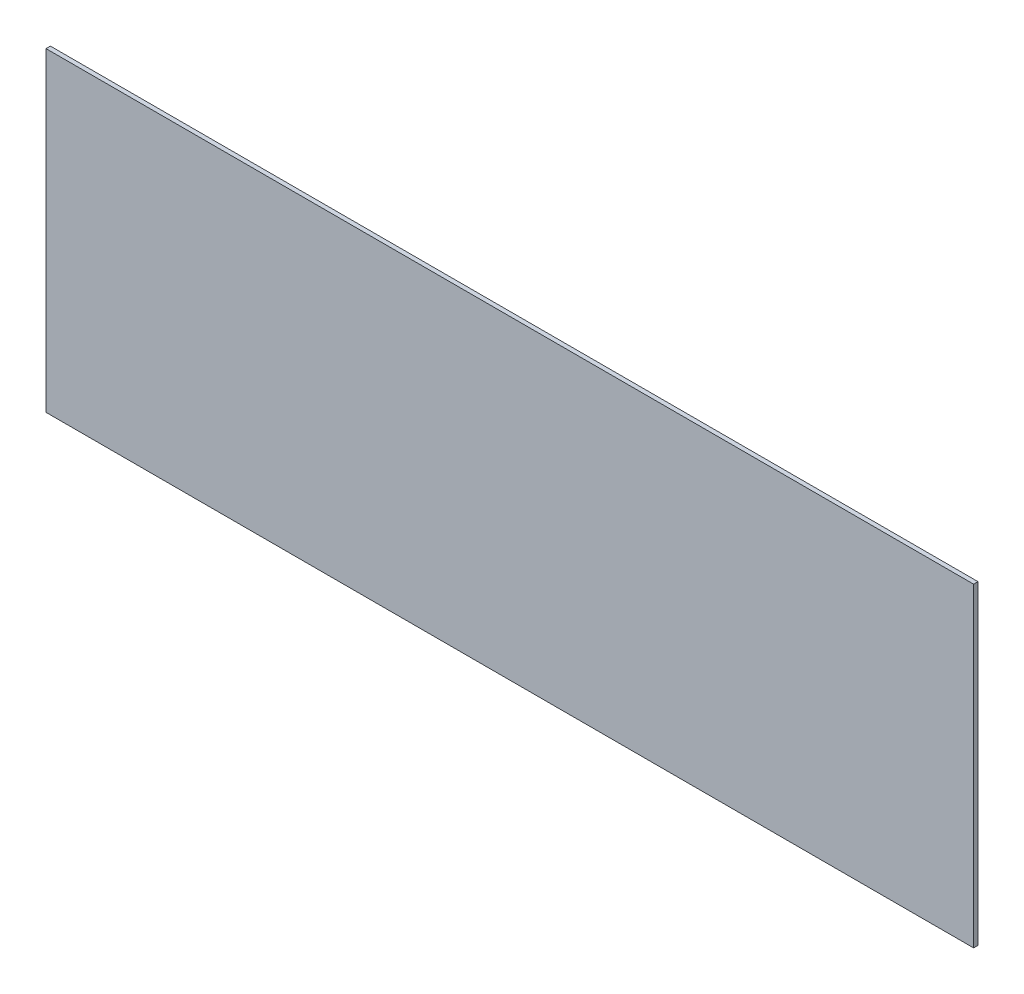
ISO-10303-21;
HEADER;
FILE_DESCRIPTION(('STEP AP214'),'2;1');
FILE_NAME('part.step','',(''),(''),'','','');
FILE_SCHEMA(('AUTOMOTIVE_DESIGN { 1 0 10303 214 1 1 1 1 }'));
ENDSEC;
DATA;
#1=APPLICATION_CONTEXT('core data for automotive mechanical design processes');
#2=APPLICATION_PROTOCOL_DEFINITION('international standard','automotive_design',2000,#1);
#3=PRODUCT_CONTEXT('',#1,'mechanical');
#4=PRODUCT('Part','Part','',(#3));
#5=PRODUCT_RELATED_PRODUCT_CATEGORY('part','',(#4));
#6=PRODUCT_DEFINITION_FORMATION('','',#4);
#7=PRODUCT_DEFINITION_CONTEXT('part definition',#1,'design');
#8=PRODUCT_DEFINITION('design','',#6,#7);
#9=PRODUCT_DEFINITION_SHAPE('','',#8);
#10=(LENGTH_UNIT() NAMED_UNIT(*) SI_UNIT(.MILLI.,.METRE.));
#11=(NAMED_UNIT(*) PLANE_ANGLE_UNIT() SI_UNIT($,.RADIAN.));
#12=(NAMED_UNIT(*) SI_UNIT($,.STERADIAN.) SOLID_ANGLE_UNIT());
#13=UNCERTAINTY_MEASURE_WITH_UNIT(LENGTH_MEASURE(1.E-05),#10,'distance_accuracy_value','');
#14=(GEOMETRIC_REPRESENTATION_CONTEXT(3) GLOBAL_UNCERTAINTY_ASSIGNED_CONTEXT((#13)) GLOBAL_UNIT_ASSIGNED_CONTEXT((#10,
#11,#12)) REPRESENTATION_CONTEXT('',''));
#15=CARTESIAN_POINT('',(0.,0.,0.));
#16=DIRECTION('',(0.,0.,1.));
#17=DIRECTION('',(1.,0.,0.));
#18=AXIS2_PLACEMENT_3D('',#15,#16,#17);
#19=CARTESIAN_POINT('',(0.,0.,3.175));
#20=DIRECTION('',(0.,0.,1.));
#21=DIRECTION('',(1.,0.,0.));
#22=AXIS2_PLACEMENT_3D('',#19,#20,#21);
#23=PLANE('',#22);
#24=DIRECTION('',(0.,1.,0.));
#25=VECTOR('',#24,1.);
#26=CARTESIAN_POINT('',(0.,228.6,3.175));
#27=LINE('',#26,#25);
#28=CARTESIAN_POINT('',(0.,0.,3.175));
#29=VERTEX_POINT('',#28);
#30=CARTESIAN_POINT('',(0.,228.6,3.175));
#31=VERTEX_POINT('',#30);
#32=EDGE_CURVE('E67',#29,#31,#27,.T.);
#33=ORIENTED_EDGE('',*,*,#32,.F.);
#34=DIRECTION('',(1.,0.,0.));
#35=VECTOR('',#34,1.);
#36=CARTESIAN_POINT('',(0.,0.,3.175));
#37=LINE('',#36,#35);
#38=CARTESIAN_POINT('',(673.1,0.,3.175));
#39=VERTEX_POINT('',#38);
#40=EDGE_CURVE('E19',#39,#29,#37,.F.);
#41=ORIENTED_EDGE('',*,*,#40,.F.);
#42=DIRECTION('',(0.,1.,0.));
#43=VECTOR('',#42,1.);
#44=CARTESIAN_POINT('',(673.1,0.,3.175));
#45=LINE('',#44,#43);
#46=CARTESIAN_POINT('',(673.1,228.6,3.175));
#47=VERTEX_POINT('',#46);
#48=EDGE_CURVE('E57',#47,#39,#45,.F.);
#49=ORIENTED_EDGE('',*,*,#48,.F.);
#50=DIRECTION('',(1.,0.,0.));
#51=VECTOR('',#50,1.);
#52=CARTESIAN_POINT('',(673.1,228.6,3.175));
#53=LINE('',#52,#51);
#54=EDGE_CURVE('E52',#31,#47,#53,.T.);
#55=ORIENTED_EDGE('',*,*,#54,.F.);
#56=EDGE_LOOP('',(#33,#41,#49,#55));
#57=FACE_BOUND('',#56,.T.);
#58=ADVANCED_FACE('F16',(#57),#23,.T.);
#59=CARTESIAN_POINT('',(0.,0.,0.));
#60=DIRECTION('',(0.,-1.,0.));
#61=DIRECTION('',(0.,0.,-1.));
#62=AXIS2_PLACEMENT_3D('',#59,#60,#61);
#63=PLANE('',#62);
#64=DIRECTION('',(0.,0.,1.));
#65=VECTOR('',#64,1.);
#66=CARTESIAN_POINT('',(0.,0.,0.));
#67=LINE('',#66,#65);
#68=CARTESIAN_POINT('',(0.,0.,0.));
#69=VERTEX_POINT('',#68);
#70=EDGE_CURVE('E78',#69,#29,#67,.T.);
#71=ORIENTED_EDGE('',*,*,#70,.F.);
#72=DIRECTION('',(1.,0.,0.));
#73=VECTOR('',#72,1.);
#74=CARTESIAN_POINT('',(0.,0.,0.));
#75=LINE('',#74,#73);
#76=CARTESIAN_POINT('',(673.1,0.,0.));
#77=VERTEX_POINT('',#76);
#78=EDGE_CURVE('E73',#69,#77,#75,.T.);
#79=ORIENTED_EDGE('',*,*,#78,.T.);
#80=DIRECTION('',(0.,0.,-1.));
#81=VECTOR('',#80,1.);
#82=CARTESIAN_POINT('',(673.1,0.,0.));
#83=LINE('',#82,#81);
#84=EDGE_CURVE('E62',#39,#77,#83,.T.);
#85=ORIENTED_EDGE('',*,*,#84,.F.);
#86=ORIENTED_EDGE('',*,*,#40,.T.);
#87=EDGE_LOOP('',(#71,#79,#85,#86));
#88=FACE_BOUND('',#87,.T.);
#89=ADVANCED_FACE('F72',(#88),#63,.T.);
#90=CARTESIAN_POINT('',(673.1,0.,0.));
#91=DIRECTION('',(1.,0.,0.));
#92=DIRECTION('',(0.,0.,-1.));
#93=AXIS2_PLACEMENT_3D('',#90,#91,#92);
#94=PLANE('',#93);
#95=ORIENTED_EDGE('',*,*,#84,.T.);
#96=DIRECTION('',(0.,1.,0.));
#97=VECTOR('',#96,1.);
#98=CARTESIAN_POINT('',(673.1,0.,0.));
#99=LINE('',#98,#97);
#100=CARTESIAN_POINT('',(673.1,228.6,0.));
#101=VERTEX_POINT('',#100);
#102=EDGE_CURVE('E83',#77,#101,#99,.T.);
#103=ORIENTED_EDGE('',*,*,#102,.T.);
#104=DIRECTION('',(0.,0.,1.));
#105=VECTOR('',#104,1.);
#106=CARTESIAN_POINT('',(673.1,228.6,0.));
#107=LINE('',#106,#105);
#108=EDGE_CURVE('E64',#47,#101,#107,.F.);
#109=ORIENTED_EDGE('',*,*,#108,.F.);
#110=ORIENTED_EDGE('',*,*,#48,.T.);
#111=EDGE_LOOP('',(#95,#103,#109,#110));
#112=FACE_BOUND('',#111,.T.);
#113=ADVANCED_FACE('F59',(#112),#94,.T.);
#114=CARTESIAN_POINT('',(673.1,228.6,0.));
#115=DIRECTION('',(0.,1.,0.));
#116=DIRECTION('',(0.,0.,1.));
#117=AXIS2_PLACEMENT_3D('',#114,#115,#116);
#118=PLANE('',#117);
#119=ORIENTED_EDGE('',*,*,#108,.T.);
#120=DIRECTION('',(1.,0.,0.));
#121=VECTOR('',#120,1.);
#122=CARTESIAN_POINT('',(0.,228.6,0.));
#123=LINE('',#122,#121);
#124=CARTESIAN_POINT('',(0.,228.6,0.));
#125=VERTEX_POINT('',#124);
#126=EDGE_CURVE('E25',#101,#125,#123,.F.);
#127=ORIENTED_EDGE('',*,*,#126,.T.);
#128=DIRECTION('',(0.,0.,1.));
#129=VECTOR('',#128,1.);
#130=CARTESIAN_POINT('',(0.,228.6,0.));
#131=LINE('',#130,#129);
#132=EDGE_CURVE('E33',#31,#125,#131,.F.);
#133=ORIENTED_EDGE('',*,*,#132,.F.);
#134=ORIENTED_EDGE('',*,*,#54,.T.);
#135=EDGE_LOOP('',(#119,#127,#133,#134));
#136=FACE_BOUND('',#135,.T.);
#137=ADVANCED_FACE('F87',(#136),#118,.T.);
#138=CARTESIAN_POINT('',(0.,228.6,0.));
#139=DIRECTION('',(-1.,0.,0.));
#140=DIRECTION('',(0.,0.,1.));
#141=AXIS2_PLACEMENT_3D('',#138,#139,#140);
#142=PLANE('',#141);
#143=ORIENTED_EDGE('',*,*,#132,.T.);
#144=DIRECTION('',(0.,1.,0.));
#145=VECTOR('',#144,1.);
#146=CARTESIAN_POINT('',(0.,0.,0.));
#147=LINE('',#146,#145);
#148=EDGE_CURVE('E11',#125,#69,#147,.F.);
#149=ORIENTED_EDGE('',*,*,#148,.T.);
#150=ORIENTED_EDGE('',*,*,#70,.T.);
#151=ORIENTED_EDGE('',*,*,#32,.T.);
#152=EDGE_LOOP('',(#143,#149,#150,#151));
#153=FACE_BOUND('',#152,.T.);
#154=ADVANCED_FACE('F90',(#153),#142,.T.);
#155=CARTESIAN_POINT('',(0.,0.,0.));
#156=DIRECTION('',(0.,0.,1.));
#157=DIRECTION('',(1.,0.,0.));
#158=AXIS2_PLACEMENT_3D('',#155,#156,#157);
#159=PLANE('',#158);
#160=ORIENTED_EDGE('',*,*,#126,.F.);
#161=ORIENTED_EDGE('',*,*,#102,.F.);
#162=ORIENTED_EDGE('',*,*,#78,.F.);
#163=ORIENTED_EDGE('',*,*,#148,.F.);
#164=EDGE_LOOP('',(#160,#161,#162,#163));
#165=FACE_BOUND('',#164,.T.);
#166=ADVANCED_FACE('F89',(#165),#159,.F.);
#167=CLOSED_SHELL('',(#58,#89,#113,#137,#154,#166));
#168=MANIFOLD_SOLID_BREP('B1',#167);
#169=ADVANCED_BREP_SHAPE_REPRESENTATION('',(#18,#168),#14);
#170=SHAPE_DEFINITION_REPRESENTATION(#9,#169);
ENDSEC;
END-ISO-10303-21;
